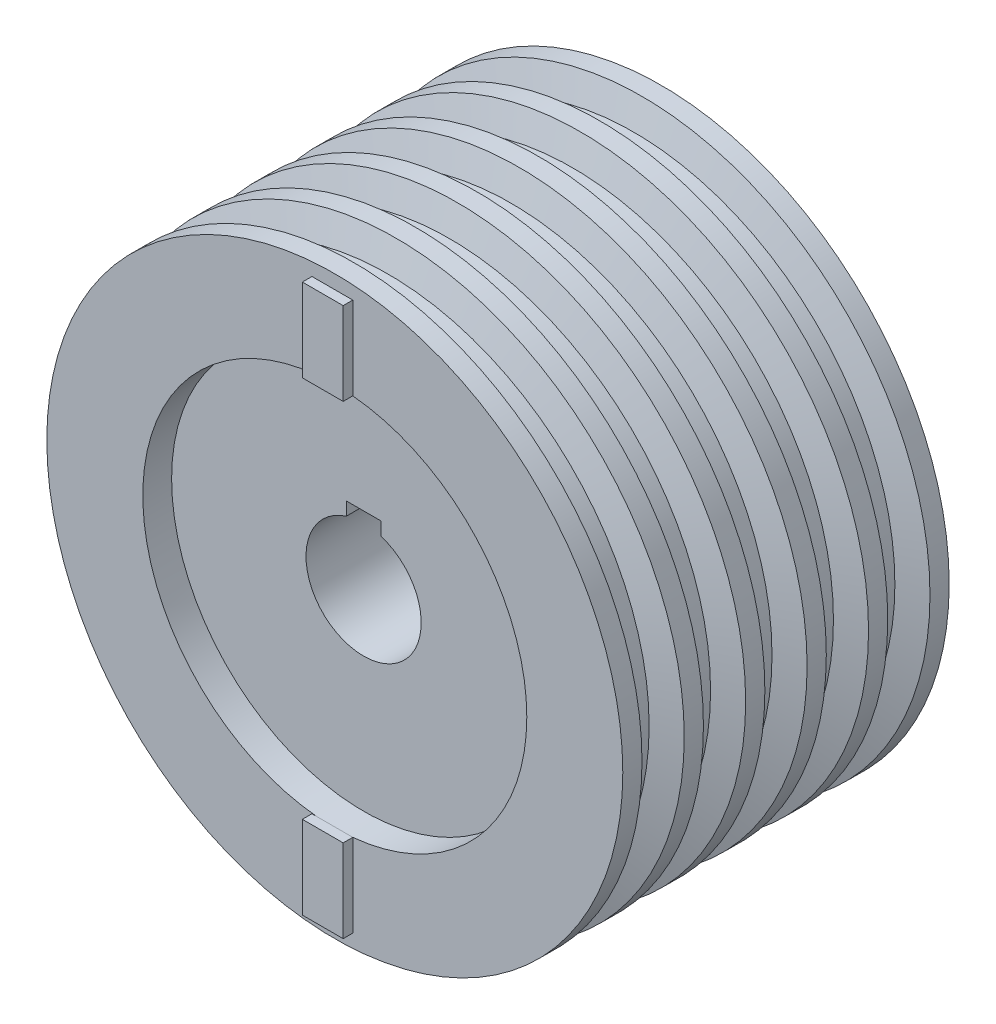
ISO-10303-21;
HEADER;
FILE_DESCRIPTION(('STEP AP214'),'2;1');
FILE_NAME('part.step','',(''),(''),'','','');
FILE_SCHEMA(('AUTOMOTIVE_DESIGN { 1 0 10303 214 1 1 1 1 }'));
ENDSEC;
DATA;
#1=APPLICATION_CONTEXT('core data for automotive mechanical design processes');
#2=APPLICATION_PROTOCOL_DEFINITION('international standard','automotive_design',2000,#1);
#3=PRODUCT_CONTEXT('',#1,'mechanical');
#4=PRODUCT('Part','Part','',(#3));
#5=PRODUCT_RELATED_PRODUCT_CATEGORY('part','',(#4));
#6=PRODUCT_DEFINITION_FORMATION('','',#4);
#7=PRODUCT_DEFINITION_CONTEXT('part definition',#1,'design');
#8=PRODUCT_DEFINITION('design','',#6,#7);
#9=PRODUCT_DEFINITION_SHAPE('','',#8);
#10=(LENGTH_UNIT() NAMED_UNIT(*) SI_UNIT(.MILLI.,.METRE.));
#11=(NAMED_UNIT(*) PLANE_ANGLE_UNIT() SI_UNIT($,.RADIAN.));
#12=(NAMED_UNIT(*) SI_UNIT($,.STERADIAN.) SOLID_ANGLE_UNIT());
#13=UNCERTAINTY_MEASURE_WITH_UNIT(LENGTH_MEASURE(1.E-05),#10,'distance_accuracy_value','');
#14=(GEOMETRIC_REPRESENTATION_CONTEXT(3) GLOBAL_UNCERTAINTY_ASSIGNED_CONTEXT((#13)) GLOBAL_UNIT_ASSIGNED_CONTEXT((#10,
#11,#12)) REPRESENTATION_CONTEXT('',''));
#15=CARTESIAN_POINT('',(0.,0.,0.));
#16=DIRECTION('',(0.,0.,1.));
#17=DIRECTION('',(1.,0.,0.));
#18=AXIS2_PLACEMENT_3D('',#15,#16,#17);
#19=CARTESIAN_POINT('',(0.,0.,85.));
#20=DIRECTION('',(0.,0.,-1.));
#21=DIRECTION('',(-1.,0.,0.));
#22=AXIS2_PLACEMENT_3D('',#19,#20,#21);
#23=CYLINDRICAL_SURFACE('',#22,150.);
#24=CARTESIAN_POINT('',(0.,0.,-75.));
#25=DIRECTION('',(0.,0.,1.));
#26=DIRECTION('',(1.,0.,0.));
#27=AXIS2_PLACEMENT_3D('',#24,#25,#26);
#28=CIRCLE('',#27,150.);
#29=CARTESIAN_POINT('',(150.,0.,-75.));
#30=VERTEX_POINT('',#29);
#31=EDGE_CURVE('E238',#30,#30,#28,.T.);
#32=ORIENTED_EDGE('',*,*,#31,.F.);
#33=EDGE_LOOP('',(#32));
#34=FACE_BOUND('',#33,.T.);
#35=CARTESIAN_POINT('',(0.,0.,-85.));
#36=DIRECTION('',(0.,0.,1.));
#37=DIRECTION('',(1.,0.,0.));
#38=AXIS2_PLACEMENT_3D('',#35,#36,#37);
#39=CIRCLE('',#38,150.);
#40=CARTESIAN_POINT('',(150.,0.,-85.));
#41=VERTEX_POINT('',#40);
#42=EDGE_CURVE('E346',#41,#41,#39,.T.);
#43=ORIENTED_EDGE('',*,*,#42,.T.);
#44=EDGE_LOOP('',(#43));
#45=FACE_BOUND('',#44,.T.);
#46=ADVANCED_FACE('F49',(#34,#45),#23,.T.);
#47=CARTESIAN_POINT('',(0.,0.,-85.));
#48=DIRECTION('',(0.,0.,1.));
#49=DIRECTION('',(1.,0.,0.));
#50=AXIS2_PLACEMENT_3D('',#47,#48,#49);
#51=CYLINDRICAL_SURFACE('',#50,30.);
#52=CARTESIAN_POINT('',(0.,0.,70.));
#53=DIRECTION('',(0.,0.,1.));
#54=DIRECTION('',(1.,0.,0.));
#55=AXIS2_PLACEMENT_3D('',#52,#53,#54);
#56=CIRCLE('',#55,30.);
#57=CARTESIAN_POINT('',(-8.99999999999999,28.6181760425084,70.));
#58=VERTEX_POINT('',#57);
#59=CARTESIAN_POINT('',(9.00000000000001,28.6181760425084,70.));
#60=VERTEX_POINT('',#59);
#61=EDGE_CURVE('E334',#58,#60,#56,.T.);
#62=ORIENTED_EDGE('',*,*,#61,.T.);
#63=DIRECTION('',(0.,0.,1.));
#64=VECTOR('',#63,1.);
#65=CARTESIAN_POINT('',(9.00000000000001,28.6181760425084,-85.));
#66=LINE('',#65,#64);
#67=CARTESIAN_POINT('',(9.00000000000001,28.6181760425084,-70.));
#68=VERTEX_POINT('',#67);
#69=EDGE_CURVE('E321',#60,#68,#66,.F.);
#70=ORIENTED_EDGE('',*,*,#69,.T.);
#71=CARTESIAN_POINT('',(0.,0.,-70.));
#72=DIRECTION('',(0.,0.,1.));
#73=DIRECTION('',(1.,0.,0.));
#74=AXIS2_PLACEMENT_3D('',#71,#72,#73);
#75=CIRCLE('',#74,30.);
#76=CARTESIAN_POINT('',(-8.99999999999999,28.6181760425084,-70.));
#77=VERTEX_POINT('',#76);
#78=EDGE_CURVE('E325',#77,#68,#75,.T.);
#79=ORIENTED_EDGE('',*,*,#78,.F.);
#80=DIRECTION('',(0.,0.,1.));
#81=VECTOR('',#80,1.);
#82=CARTESIAN_POINT('',(-8.99999999999999,28.6181760425084,-85.));
#83=LINE('',#82,#81);
#84=EDGE_CURVE('E314',#77,#58,#83,.T.);
#85=ORIENTED_EDGE('',*,*,#84,.T.);
#86=EDGE_LOOP('',(#62,#70,#79,#85));
#87=FACE_BOUND('',#86,.T.);
#88=ADVANCED_FACE('F375',(#87),#51,.F.);
#89=CARTESIAN_POINT('',(0.,0.,-85.));
#90=DIRECTION('',(0.,0.,1.));
#91=DIRECTION('',(1.,0.,0.));
#92=AXIS2_PLACEMENT_3D('',#89,#90,#91);
#93=PLANE('',#92);
#94=ORIENTED_EDGE('',*,*,#42,.F.);
#95=EDGE_LOOP('',(#94));
#96=FACE_BOUND('',#95,.T.);
#97=CARTESIAN_POINT('',(0.,0.,-85.));
#98=DIRECTION('',(0.,0.,1.));
#99=DIRECTION('',(1.,0.,0.));
#100=AXIS2_PLACEMENT_3D('',#97,#98,#99);
#101=CIRCLE('',#100,100.);
#102=CARTESIAN_POINT('',(100.,0.,-85.));
#103=VERTEX_POINT('',#102);
#104=EDGE_CURVE('E329',#103,#103,#101,.T.);
#105=ORIENTED_EDGE('',*,*,#104,.T.);
#106=EDGE_LOOP('',(#105));
#107=FACE_BOUND('',#106,.T.);
#108=ADVANCED_FACE('F463',(#96,#107),#93,.F.);
#109=CARTESIAN_POINT('',(0.,0.,75.));
#110=DIRECTION('',(0.,0.,1.));
#111=DIRECTION('',(1.,0.,0.));
#112=AXIS2_PLACEMENT_3D('',#109,#110,#111);
#113=CIRCLE('',#112,150.);
#114=CARTESIAN_POINT('',(150.,0.,75.));
#115=VERTEX_POINT('',#114);
#116=EDGE_CURVE('E171',#115,#115,#113,.T.);
#117=ORIENTED_EDGE('',*,*,#116,.T.);
#118=EDGE_LOOP('',(#117));
#119=FACE_BOUND('',#118,.T.);
#120=CARTESIAN_POINT('',(0.,0.,85.));
#121=DIRECTION('',(0.,0.,1.));
#122=DIRECTION('',(1.,0.,0.));
#123=AXIS2_PLACEMENT_3D('',#120,#121,#122);
#124=CIRCLE('',#123,150.);
#125=CARTESIAN_POINT('',(150.,0.,85.));
#126=VERTEX_POINT('',#125);
#127=EDGE_CURVE('E351',#126,#126,#124,.T.);
#128=ORIENTED_EDGE('',*,*,#127,.F.);
#129=EDGE_LOOP('',(#128));
#130=FACE_BOUND('',#129,.T.);
#131=ADVANCED_FACE('F51',(#119,#130),#23,.T.);
#132=CARTESIAN_POINT('',(0.,0.,85.));
#133=DIRECTION('',(0.,0.,1.));
#134=DIRECTION('',(1.,0.,0.));
#135=AXIS2_PLACEMENT_3D('',#132,#133,#134);
#136=PLANE('',#135);
#137=DIRECTION('',(0.,1.,0.));
#138=VECTOR('',#137,1.);
#139=CARTESIAN_POINT('',(9.35394208110603,142.779652881161,85.));
#140=LINE('',#139,#138);
#141=CARTESIAN_POINT('',(9.35394208110616,99.561557679374,85.));
#142=VERTEX_POINT('',#141);
#143=CARTESIAN_POINT('',(9.35394208110603,142.779652881161,85.));
#144=VERTEX_POINT('',#143);
#145=EDGE_CURVE('E413',#142,#144,#140,.T.);
#146=ORIENTED_EDGE('',*,*,#145,.F.);
#147=CARTESIAN_POINT('',(0.,0.,85.));
#148=DIRECTION('',(0.,0.,1.));
#149=DIRECTION('',(1.,0.,0.));
#150=AXIS2_PLACEMENT_3D('',#147,#148,#149);
#151=CIRCLE('',#150,100.);
#152=CARTESIAN_POINT('',(9.35394208110603,-99.561557679374,85.));
#153=VERTEX_POINT('',#152);
#154=EDGE_CURVE('E341',#153,#142,#151,.T.);
#155=ORIENTED_EDGE('',*,*,#154,.F.);
#156=DIRECTION('',(0.,1.,0.));
#157=VECTOR('',#156,1.);
#158=CARTESIAN_POINT('',(9.35394208110603,-142.779652881161,85.));
#159=LINE('',#158,#157);
#160=CARTESIAN_POINT('',(9.35394208110603,-142.779652881161,85.));
#161=VERTEX_POINT('',#160);
#162=EDGE_CURVE('E206',#161,#153,#159,.T.);
#163=ORIENTED_EDGE('',*,*,#162,.F.);
#164=DIRECTION('',(1.,0.,0.));
#165=VECTOR('',#164,1.);
#166=CARTESIAN_POINT('',(-11.9030294730821,-142.779652881161,85.));
#167=LINE('',#166,#165);
#168=CARTESIAN_POINT('',(-11.9030294730821,-142.779652881161,85.));
#169=VERTEX_POINT('',#168);
#170=EDGE_CURVE('E210',#169,#161,#167,.T.);
#171=ORIENTED_EDGE('',*,*,#170,.F.);
#172=DIRECTION('',(0.,-1.,0.));
#173=VECTOR('',#172,1.);
#174=CARTESIAN_POINT('',(-11.9030294730821,-142.779652881161,85.));
#175=LINE('',#174,#173);
#176=CARTESIAN_POINT('',(-11.9030294730821,-99.561557679374,85.));
#177=VERTEX_POINT('',#176);
#178=EDGE_CURVE('E199',#177,#169,#175,.T.);
#179=ORIENTED_EDGE('',*,*,#178,.F.);
#180=DIRECTION('',(-1.,0.,0.));
#181=VECTOR('',#180,1.);
#182=CARTESIAN_POINT('',(-11.9030294730821,-99.561557679374,85.));
#183=LINE('',#182,#181);
#184=CARTESIAN_POINT('',(-9.35394208110616,-99.561557679374,85.));
#185=VERTEX_POINT('',#184);
#186=EDGE_CURVE('E11',#185,#177,#183,.T.);
#187=ORIENTED_EDGE('',*,*,#186,.F.);
#188=CARTESIAN_POINT('',(-9.35394208110616,99.561557679374,85.));
#189=VERTEX_POINT('',#188);
#190=EDGE_CURVE('E350',#189,#185,#151,.T.);
#191=ORIENTED_EDGE('',*,*,#190,.F.);
#192=DIRECTION('',(1.,0.,0.));
#193=VECTOR('',#192,1.);
#194=CARTESIAN_POINT('',(-11.9030294730821,99.561557679374,85.));
#195=LINE('',#194,#193);
#196=CARTESIAN_POINT('',(-11.9030294730821,99.561557679374,85.));
#197=VERTEX_POINT('',#196);
#198=EDGE_CURVE('E405',#197,#189,#195,.T.);
#199=ORIENTED_EDGE('',*,*,#198,.F.);
#200=DIRECTION('',(0.,-1.,0.));
#201=VECTOR('',#200,1.);
#202=CARTESIAN_POINT('',(-11.9030294730821,142.779652881161,85.));
#203=LINE('',#202,#201);
#204=CARTESIAN_POINT('',(-11.9030294730821,142.779652881161,85.));
#205=VERTEX_POINT('',#204);
#206=EDGE_CURVE('E72',#205,#197,#203,.T.);
#207=ORIENTED_EDGE('',*,*,#206,.F.);
#208=DIRECTION('',(-1.,0.,0.));
#209=VECTOR('',#208,1.);
#210=CARTESIAN_POINT('',(-11.9030294730821,142.779652881161,85.));
#211=LINE('',#210,#209);
#212=EDGE_CURVE('E67',#144,#205,#211,.T.);
#213=ORIENTED_EDGE('',*,*,#212,.F.);
#214=EDGE_LOOP('',(#146,#155,#163,#171,#179,#187,#191,#199,#207,#213));
#215=FACE_BOUND('',#214,.T.);
#216=ORIENTED_EDGE('',*,*,#127,.T.);
#217=EDGE_LOOP('',(#216));
#218=FACE_BOUND('',#217,.T.);
#219=ADVANCED_FACE('F394',(#215,#218),#136,.T.);
#220=CARTESIAN_POINT('',(0.,0.,70.));
#221=DIRECTION('',(0.,0.,1.));
#222=DIRECTION('',(1.,0.,0.));
#223=AXIS2_PLACEMENT_3D('',#220,#221,#222);
#224=CYLINDRICAL_SURFACE('',#223,100.);
#225=CARTESIAN_POINT('',(0.,0.,70.));
#226=DIRECTION('',(0.,0.,1.));
#227=DIRECTION('',(1.,0.,0.));
#228=AXIS2_PLACEMENT_3D('',#225,#226,#227);
#229=CIRCLE('',#228,100.);
#230=CARTESIAN_POINT('',(100.,0.,70.));
#231=VERTEX_POINT('',#230);
#232=EDGE_CURVE('E342',#231,#231,#229,.T.);
#233=ORIENTED_EDGE('',*,*,#232,.F.);
#234=EDGE_LOOP('',(#233));
#235=FACE_BOUND('',#234,.T.);
#236=EDGE_CURVE('E347',#142,#189,#151,.T.);
#237=ORIENTED_EDGE('',*,*,#236,.T.);
#238=ORIENTED_EDGE('',*,*,#190,.T.);
#239=EDGE_CURVE('E407',#185,#153,#151,.T.);
#240=ORIENTED_EDGE('',*,*,#239,.T.);
#241=ORIENTED_EDGE('',*,*,#154,.T.);
#242=EDGE_LOOP('',(#237,#238,#240,#241));
#243=FACE_BOUND('',#242,.T.);
#244=ADVANCED_FACE('F388',(#235,#243),#224,.F.);
#245=CARTESIAN_POINT('',(0.,0.,70.));
#246=DIRECTION('',(0.,0.,1.));
#247=DIRECTION('',(1.,0.,0.));
#248=AXIS2_PLACEMENT_3D('',#245,#246,#247);
#249=PLANE('',#248);
#250=DIRECTION('',(0.,1.,0.));
#251=VECTOR('',#250,1.);
#252=CARTESIAN_POINT('',(9.00000000000001,24.5,70.));
#253=LINE('',#252,#251);
#254=CARTESIAN_POINT('',(9.00000000000001,35.5,70.));
#255=VERTEX_POINT('',#254);
#256=EDGE_CURVE('E242',#60,#255,#253,.T.);
#257=ORIENTED_EDGE('',*,*,#256,.F.);
#258=ORIENTED_EDGE('',*,*,#61,.F.);
#259=DIRECTION('',(0.,-1.,0.));
#260=VECTOR('',#259,1.);
#261=CARTESIAN_POINT('',(-8.99999999999999,24.5,70.));
#262=LINE('',#261,#260);
#263=CARTESIAN_POINT('',(-8.99999999999999,35.5,70.));
#264=VERTEX_POINT('',#263);
#265=EDGE_CURVE('E307',#264,#58,#262,.T.);
#266=ORIENTED_EDGE('',*,*,#265,.F.);
#267=DIRECTION('',(-1.,0.,0.));
#268=VECTOR('',#267,1.);
#269=CARTESIAN_POINT('',(-8.99999999999999,35.5,70.));
#270=LINE('',#269,#268);
#271=EDGE_CURVE('E303',#255,#264,#270,.T.);
#272=ORIENTED_EDGE('',*,*,#271,.F.);
#273=EDGE_LOOP('',(#257,#258,#266,#272));
#274=FACE_BOUND('',#273,.T.);
#275=ORIENTED_EDGE('',*,*,#232,.T.);
#276=EDGE_LOOP('',(#275));
#277=FACE_BOUND('',#276,.T.);
#278=ADVANCED_FACE('F385',(#274,#277),#249,.T.);
#279=CARTESIAN_POINT('',(0.,0.,-70.));
#280=DIRECTION('',(0.,0.,-1.));
#281=DIRECTION('',(1.,0.,0.));
#282=AXIS2_PLACEMENT_3D('',#279,#280,#281);
#283=PLANE('',#282);
#284=DIRECTION('',(0.,-1.,0.));
#285=VECTOR('',#284,1.);
#286=CARTESIAN_POINT('',(9.00000000000001,0.,-70.));
#287=LINE('',#286,#285);
#288=CARTESIAN_POINT('',(9.00000000000001,35.5,-70.));
#289=VERTEX_POINT('',#288);
#290=EDGE_CURVE('E53',#289,#68,#287,.T.);
#291=ORIENTED_EDGE('',*,*,#290,.F.);
#292=DIRECTION('',(1.,0.,0.));
#293=VECTOR('',#292,1.);
#294=CARTESIAN_POINT('',(0.,35.5,-70.));
#295=LINE('',#294,#293);
#296=CARTESIAN_POINT('',(-8.99999999999999,35.5,-70.));
#297=VERTEX_POINT('',#296);
#298=EDGE_CURVE('E355',#297,#289,#295,.T.);
#299=ORIENTED_EDGE('',*,*,#298,.F.);
#300=DIRECTION('',(0.,1.,0.));
#301=VECTOR('',#300,1.);
#302=CARTESIAN_POINT('',(-8.99999999999999,0.,-70.));
#303=LINE('',#302,#301);
#304=EDGE_CURVE('E360',#77,#297,#303,.T.);
#305=ORIENTED_EDGE('',*,*,#304,.F.);
#306=ORIENTED_EDGE('',*,*,#78,.T.);
#307=EDGE_LOOP('',(#291,#299,#305,#306));
#308=FACE_BOUND('',#307,.T.);
#309=CARTESIAN_POINT('',(0.,0.,-70.));
#310=DIRECTION('',(0.,0.,1.));
#311=DIRECTION('',(1.,0.,0.));
#312=AXIS2_PLACEMENT_3D('',#309,#310,#311);
#313=CIRCLE('',#312,100.);
#314=CARTESIAN_POINT('',(100.,0.,-70.));
#315=VERTEX_POINT('',#314);
#316=EDGE_CURVE('E330',#315,#315,#313,.T.);
#317=ORIENTED_EDGE('',*,*,#316,.F.);
#318=EDGE_LOOP('',(#317));
#319=FACE_BOUND('',#318,.T.);
#320=ADVANCED_FACE('F377',(#308,#319),#283,.T.);
#321=CARTESIAN_POINT('',(0.,0.,-70.));
#322=DIRECTION('',(0.,0.,-1.));
#323=DIRECTION('',(-1.,0.,0.));
#324=AXIS2_PLACEMENT_3D('',#321,#322,#323);
#325=CYLINDRICAL_SURFACE('',#324,100.);
#326=ORIENTED_EDGE('',*,*,#316,.T.);
#327=EDGE_LOOP('',(#326));
#328=FACE_BOUND('',#327,.T.);
#329=ORIENTED_EDGE('',*,*,#104,.F.);
#330=EDGE_LOOP('',(#329));
#331=FACE_BOUND('',#330,.T.);
#332=ADVANCED_FACE('F564',(#328,#331),#325,.F.);
#333=CARTESIAN_POINT('',(9.00000000000001,24.5,-85.));
#334=DIRECTION('',(1.,0.,0.));
#335=DIRECTION('',(0.,0.,-1.));
#336=AXIS2_PLACEMENT_3D('',#333,#334,#335);
#337=PLANE('',#336);
#338=ORIENTED_EDGE('',*,*,#256,.T.);
#339=DIRECTION('',(0.,0.,1.));
#340=VECTOR('',#339,1.);
#341=CARTESIAN_POINT('',(9.00000000000001,35.5,-85.));
#342=LINE('',#341,#340);
#343=EDGE_CURVE('E310',#289,#255,#342,.T.);
#344=ORIENTED_EDGE('',*,*,#343,.F.);
#345=ORIENTED_EDGE('',*,*,#290,.T.);
#346=ORIENTED_EDGE('',*,*,#69,.F.);
#347=EDGE_LOOP('',(#338,#344,#345,#346));
#348=FACE_BOUND('',#347,.T.);
#349=ADVANCED_FACE('F370',(#348),#337,.F.);
#350=CARTESIAN_POINT('',(-8.99999999999999,24.5,-85.));
#351=DIRECTION('',(-1.,0.,0.));
#352=DIRECTION('',(0.,0.,1.));
#353=AXIS2_PLACEMENT_3D('',#350,#351,#352);
#354=PLANE('',#353);
#355=ORIENTED_EDGE('',*,*,#304,.T.);
#356=DIRECTION('',(0.,0.,1.));
#357=VECTOR('',#356,1.);
#358=CARTESIAN_POINT('',(-8.99999999999999,35.5,-85.));
#359=LINE('',#358,#357);
#360=EDGE_CURVE('E311',#297,#264,#359,.T.);
#361=ORIENTED_EDGE('',*,*,#360,.T.);
#362=ORIENTED_EDGE('',*,*,#265,.T.);
#363=ORIENTED_EDGE('',*,*,#84,.F.);
#364=EDGE_LOOP('',(#355,#361,#362,#363));
#365=FACE_BOUND('',#364,.T.);
#366=ADVANCED_FACE('F383',(#365),#354,.F.);
#367=CARTESIAN_POINT('',(-8.99999999999999,35.5,-85.));
#368=DIRECTION('',(0.,1.,0.));
#369=DIRECTION('',(0.,0.,1.));
#370=AXIS2_PLACEMENT_3D('',#367,#368,#369);
#371=PLANE('',#370);
#372=ORIENTED_EDGE('',*,*,#298,.T.);
#373=ORIENTED_EDGE('',*,*,#343,.T.);
#374=ORIENTED_EDGE('',*,*,#271,.T.);
#375=ORIENTED_EDGE('',*,*,#360,.F.);
#376=EDGE_LOOP('',(#372,#373,#374,#375));
#377=FACE_BOUND('',#376,.T.);
#378=ADVANCED_FACE('F380',(#377),#371,.F.);
#379=CARTESIAN_POINT('',(0.,0.,53.));
#380=DIRECTION('',(0.,0.,-1.));
#381=DIRECTION('',(-1.,0.,0.));
#382=AXIS2_PLACEMENT_3D('',#379,#380,#381);
#383=CONICAL_SURFACE('',#382,150.,1.27409035395586);
#384=CARTESIAN_POINT('',(0.,0.,57.2802295404213));
#385=DIRECTION('',(0.,0.,1.));
#386=DIRECTION('',(1.,0.,0.));
#387=AXIS2_PLACEMENT_3D('',#384,#385,#386);
#388=CIRCLE('',#387,136.);
#389=CARTESIAN_POINT('',(136.,0.,57.2802295404213));
#390=VERTEX_POINT('',#389);
#391=EDGE_CURVE('E294',#390,#390,#388,.T.);
#392=ORIENTED_EDGE('',*,*,#391,.F.);
#393=EDGE_LOOP('',(#392));
#394=FACE_BOUND('',#393,.T.);
#395=CARTESIAN_POINT('',(0.,0.,53.));
#396=DIRECTION('',(0.,0.,1.));
#397=DIRECTION('',(1.,0.,0.));
#398=AXIS2_PLACEMENT_3D('',#395,#396,#397);
#399=CIRCLE('',#398,150.);
#400=CARTESIAN_POINT('',(150.,0.,53.));
#401=VERTEX_POINT('',#400);
#402=EDGE_CURVE('E280',#401,#401,#399,.T.);
#403=ORIENTED_EDGE('',*,*,#402,.T.);
#404=EDGE_LOOP('',(#403));
#405=FACE_BOUND('',#404,.T.);
#406=ADVANCED_FACE('F555',(#394,#405),#383,.T.);
#407=CARTESIAN_POINT('',(0.,0.,0.));
#408=DIRECTION('',(0.,0.,1.));
#409=DIRECTION('',(1.,0.,0.));
#410=AXIS2_PLACEMENT_3D('',#407,#408,#409);
#411=CYLINDRICAL_SURFACE('',#410,136.);
#412=CARTESIAN_POINT('',(0.,0.,70.7197704595789));
#413=DIRECTION('',(0.,0.,1.));
#414=DIRECTION('',(1.,0.,0.));
#415=AXIS2_PLACEMENT_3D('',#412,#413,#414);
#416=CIRCLE('',#415,136.);
#417=CARTESIAN_POINT('',(136.,0.,70.7197704595789));
#418=VERTEX_POINT('',#417);
#419=EDGE_CURVE('E176',#418,#418,#416,.T.);
#420=ORIENTED_EDGE('',*,*,#419,.F.);
#421=EDGE_LOOP('',(#420));
#422=FACE_BOUND('',#421,.T.);
#423=ORIENTED_EDGE('',*,*,#391,.T.);
#424=EDGE_LOOP('',(#423));
#425=FACE_BOUND('',#424,.T.);
#426=ADVANCED_FACE('F494',(#422,#425),#411,.T.);
#427=CARTESIAN_POINT('',(0.,0.,70.7197704595789));
#428=DIRECTION('',(0.,0.,1.));
#429=DIRECTION('',(1.,0.,0.));
#430=AXIS2_PLACEMENT_3D('',#427,#428,#429);
#431=CONICAL_SURFACE('',#430,136.,1.27409035395587);
#432=ORIENTED_EDGE('',*,*,#116,.F.);
#433=EDGE_LOOP('',(#432));
#434=FACE_BOUND('',#433,.T.);
#435=ORIENTED_EDGE('',*,*,#419,.T.);
#436=EDGE_LOOP('',(#435));
#437=FACE_BOUND('',#436,.T.);
#438=ADVANCED_FACE('F484',(#434,#437),#431,.T.);
#439=CARTESIAN_POINT('',(0.,0.,43.));
#440=DIRECTION('',(0.,0.,1.));
#441=DIRECTION('',(1.,0.,0.));
#442=AXIS2_PLACEMENT_3D('',#439,#440,#441);
#443=CIRCLE('',#442,150.);
#444=CARTESIAN_POINT('',(150.,0.,43.));
#445=VERTEX_POINT('',#444);
#446=EDGE_CURVE('E284',#445,#445,#443,.T.);
#447=ORIENTED_EDGE('',*,*,#446,.T.);
#448=EDGE_LOOP('',(#447));
#449=FACE_BOUND('',#448,.T.);
#450=ORIENTED_EDGE('',*,*,#402,.F.);
#451=EDGE_LOOP('',(#450));
#452=FACE_BOUND('',#451,.T.);
#453=ADVANCED_FACE('F473',(#449,#452),#23,.T.);
#454=CARTESIAN_POINT('',(0.,0.,21.));
#455=DIRECTION('',(0.,0.,-1.));
#456=DIRECTION('',(-1.,0.,0.));
#457=AXIS2_PLACEMENT_3D('',#454,#455,#456);
#458=CONICAL_SURFACE('',#457,150.,1.27409035395587);
#459=CARTESIAN_POINT('',(0.,0.,25.280229540421));
#460=DIRECTION('',(0.,0.,1.));
#461=DIRECTION('',(1.,0.,0.));
#462=AXIS2_PLACEMENT_3D('',#459,#460,#461);
#463=CIRCLE('',#462,136.);
#464=CARTESIAN_POINT('',(136.,0.,25.280229540421));
#465=VERTEX_POINT('',#464);
#466=EDGE_CURVE('E275',#465,#465,#463,.T.);
#467=ORIENTED_EDGE('',*,*,#466,.F.);
#468=EDGE_LOOP('',(#467));
#469=FACE_BOUND('',#468,.T.);
#470=CARTESIAN_POINT('',(0.,0.,21.));
#471=DIRECTION('',(0.,0.,1.));
#472=DIRECTION('',(1.,0.,0.));
#473=AXIS2_PLACEMENT_3D('',#470,#471,#472);
#474=CIRCLE('',#473,150.);
#475=CARTESIAN_POINT('',(150.,0.,21.));
#476=VERTEX_POINT('',#475);
#477=EDGE_CURVE('E264',#476,#476,#474,.T.);
#478=ORIENTED_EDGE('',*,*,#477,.T.);
#479=EDGE_LOOP('',(#478));
#480=FACE_BOUND('',#479,.T.);
#481=ADVANCED_FACE('F483',(#469,#480),#458,.T.);
#482=CARTESIAN_POINT('',(0.,0.,38.7197704595787));
#483=DIRECTION('',(0.,0.,1.));
#484=DIRECTION('',(1.,0.,0.));
#485=AXIS2_PLACEMENT_3D('',#482,#483,#484);
#486=CONICAL_SURFACE('',#485,136.,1.27409035395586);
#487=ORIENTED_EDGE('',*,*,#446,.F.);
#488=EDGE_LOOP('',(#487));
#489=FACE_BOUND('',#488,.T.);
#490=CARTESIAN_POINT('',(0.,0.,38.7197704595787));
#491=DIRECTION('',(0.,0.,1.));
#492=DIRECTION('',(1.,0.,0.));
#493=AXIS2_PLACEMENT_3D('',#490,#491,#492);
#494=CIRCLE('',#493,136.);
#495=CARTESIAN_POINT('',(136.,0.,38.7197704595787));
#496=VERTEX_POINT('',#495);
#497=EDGE_CURVE('E279',#496,#496,#494,.T.);
#498=ORIENTED_EDGE('',*,*,#497,.T.);
#499=EDGE_LOOP('',(#498));
#500=FACE_BOUND('',#499,.T.);
#501=ADVANCED_FACE('F491',(#489,#500),#486,.T.);
#502=CARTESIAN_POINT('',(0.,0.,0.));
#503=DIRECTION('',(0.,0.,1.));
#504=DIRECTION('',(1.,0.,0.));
#505=AXIS2_PLACEMENT_3D('',#502,#503,#504);
#506=CYLINDRICAL_SURFACE('',#505,136.);
#507=ORIENTED_EDGE('',*,*,#497,.F.);
#508=EDGE_LOOP('',(#507));
#509=FACE_BOUND('',#508,.T.);
#510=ORIENTED_EDGE('',*,*,#466,.T.);
#511=EDGE_LOOP('',(#510));
#512=FACE_BOUND('',#511,.T.);
#513=ADVANCED_FACE('F500',(#509,#512),#506,.T.);
#514=CARTESIAN_POINT('',(0.,0.,11.));
#515=DIRECTION('',(0.,0.,1.));
#516=DIRECTION('',(1.,0.,0.));
#517=AXIS2_PLACEMENT_3D('',#514,#515,#516);
#518=CIRCLE('',#517,150.);
#519=CARTESIAN_POINT('',(150.,0.,11.));
#520=VERTEX_POINT('',#519);
#521=EDGE_CURVE('E259',#520,#520,#518,.T.);
#522=ORIENTED_EDGE('',*,*,#521,.T.);
#523=EDGE_LOOP('',(#522));
#524=FACE_BOUND('',#523,.T.);
#525=ORIENTED_EDGE('',*,*,#477,.F.);
#526=EDGE_LOOP('',(#525));
#527=FACE_BOUND('',#526,.T.);
#528=ADVANCED_FACE('F486',(#524,#527),#23,.T.);
#529=CARTESIAN_POINT('',(0.,0.,-11.));
#530=DIRECTION('',(0.,0.,-1.));
#531=DIRECTION('',(-1.,0.,0.));
#532=AXIS2_PLACEMENT_3D('',#529,#530,#531);
#533=CONICAL_SURFACE('',#532,150.,1.27409035395586);
#534=CARTESIAN_POINT('',(0.,0.,-6.7197704595787));
#535=DIRECTION('',(0.,0.,1.));
#536=DIRECTION('',(1.,0.,0.));
#537=AXIS2_PLACEMENT_3D('',#534,#535,#536);
#538=CIRCLE('',#537,136.);
#539=CARTESIAN_POINT('',(136.,0.,-6.7197704595787));
#540=VERTEX_POINT('',#539);
#541=EDGE_CURVE('E268',#540,#540,#538,.T.);
#542=ORIENTED_EDGE('',*,*,#541,.F.);
#543=EDGE_LOOP('',(#542));
#544=FACE_BOUND('',#543,.T.);
#545=CARTESIAN_POINT('',(0.,0.,-11.));
#546=DIRECTION('',(0.,0.,1.));
#547=DIRECTION('',(1.,0.,0.));
#548=AXIS2_PLACEMENT_3D('',#545,#546,#547);
#549=CIRCLE('',#548,150.);
#550=CARTESIAN_POINT('',(150.,0.,-11.));
#551=VERTEX_POINT('',#550);
#552=EDGE_CURVE('E248',#551,#551,#549,.T.);
#553=ORIENTED_EDGE('',*,*,#552,.T.);
#554=EDGE_LOOP('',(#553));
#555=FACE_BOUND('',#554,.T.);
#556=ADVANCED_FACE('F499',(#544,#555),#533,.T.);
#557=CARTESIAN_POINT('',(0.,0.,0.));
#558=DIRECTION('',(0.,0.,1.));
#559=DIRECTION('',(1.,0.,0.));
#560=AXIS2_PLACEMENT_3D('',#557,#558,#559);
#561=CYLINDRICAL_SURFACE('',#560,136.);
#562=CARTESIAN_POINT('',(0.,0.,6.71977045957891));
#563=DIRECTION('',(0.,0.,1.));
#564=DIRECTION('',(1.,0.,0.));
#565=AXIS2_PLACEMENT_3D('',#562,#563,#564);
#566=CIRCLE('',#565,136.);
#567=CARTESIAN_POINT('',(136.,0.,6.71977045957891));
#568=VERTEX_POINT('',#567);
#569=EDGE_CURVE('E263',#568,#568,#566,.T.);
#570=ORIENTED_EDGE('',*,*,#569,.F.);
#571=EDGE_LOOP('',(#570));
#572=FACE_BOUND('',#571,.T.);
#573=ORIENTED_EDGE('',*,*,#541,.T.);
#574=EDGE_LOOP('',(#573));
#575=FACE_BOUND('',#574,.T.);
#576=ADVANCED_FACE('F506',(#572,#575),#561,.T.);
#577=CARTESIAN_POINT('',(0.,0.,6.71977045957891));
#578=DIRECTION('',(0.,0.,1.));
#579=DIRECTION('',(1.,0.,0.));
#580=AXIS2_PLACEMENT_3D('',#577,#578,#579);
#581=CONICAL_SURFACE('',#580,136.,1.27409035395587);
#582=ORIENTED_EDGE('',*,*,#521,.F.);
#583=EDGE_LOOP('',(#582));
#584=FACE_BOUND('',#583,.T.);
#585=ORIENTED_EDGE('',*,*,#569,.T.);
#586=EDGE_LOOP('',(#585));
#587=FACE_BOUND('',#586,.T.);
#588=ADVANCED_FACE('F514',(#584,#587),#581,.T.);
#589=CARTESIAN_POINT('',(0.,0.,-21.));
#590=DIRECTION('',(0.,0.,1.));
#591=DIRECTION('',(1.,0.,0.));
#592=AXIS2_PLACEMENT_3D('',#589,#590,#591);
#593=CIRCLE('',#592,150.);
#594=CARTESIAN_POINT('',(150.,0.,-21.));
#595=VERTEX_POINT('',#594);
#596=EDGE_CURVE('E252',#595,#595,#593,.T.);
#597=ORIENTED_EDGE('',*,*,#596,.T.);
#598=EDGE_LOOP('',(#597));
#599=FACE_BOUND('',#598,.T.);
#600=ORIENTED_EDGE('',*,*,#552,.F.);
#601=EDGE_LOOP('',(#600));
#602=FACE_BOUND('',#601,.T.);
#603=ADVANCED_FACE('F471',(#599,#602),#23,.T.);
#604=CARTESIAN_POINT('',(0.,0.,-43.));
#605=DIRECTION('',(0.,0.,-1.));
#606=DIRECTION('',(-1.,0.,0.));
#607=AXIS2_PLACEMENT_3D('',#604,#605,#606);
#608=CONICAL_SURFACE('',#607,150.,1.27409035395587);
#609=CARTESIAN_POINT('',(0.,0.,-38.7197704595789));
#610=DIRECTION('',(0.,0.,1.));
#611=DIRECTION('',(1.,0.,0.));
#612=AXIS2_PLACEMENT_3D('',#609,#610,#611);
#613=CIRCLE('',#612,136.);
#614=CARTESIAN_POINT('',(136.,0.,-38.7197704595789));
#615=VERTEX_POINT('',#614);
#616=EDGE_CURVE('E243',#615,#615,#613,.T.);
#617=ORIENTED_EDGE('',*,*,#616,.F.);
#618=EDGE_LOOP('',(#617));
#619=FACE_BOUND('',#618,.T.);
#620=CARTESIAN_POINT('',(0.,0.,-43.));
#621=DIRECTION('',(0.,0.,1.));
#622=DIRECTION('',(1.,0.,0.));
#623=AXIS2_PLACEMENT_3D('',#620,#621,#622);
#624=CIRCLE('',#623,150.);
#625=CARTESIAN_POINT('',(150.,0.,-43.));
#626=VERTEX_POINT('',#625);
#627=EDGE_CURVE('E230',#626,#626,#624,.T.);
#628=ORIENTED_EDGE('',*,*,#627,.T.);
#629=EDGE_LOOP('',(#628));
#630=FACE_BOUND('',#629,.T.);
#631=ADVANCED_FACE('F513',(#619,#630),#608,.T.);
#632=CARTESIAN_POINT('',(0.,0.,-25.2802295404213));
#633=DIRECTION('',(0.,0.,1.));
#634=DIRECTION('',(1.,0.,0.));
#635=AXIS2_PLACEMENT_3D('',#632,#633,#634);
#636=CONICAL_SURFACE('',#635,136.,1.27409035395586);
#637=ORIENTED_EDGE('',*,*,#596,.F.);
#638=EDGE_LOOP('',(#637));
#639=FACE_BOUND('',#638,.T.);
#640=CARTESIAN_POINT('',(0.,0.,-25.2802295404213));
#641=DIRECTION('',(0.,0.,1.));
#642=DIRECTION('',(1.,0.,0.));
#643=AXIS2_PLACEMENT_3D('',#640,#641,#642);
#644=CIRCLE('',#643,136.);
#645=CARTESIAN_POINT('',(136.,0.,-25.2802295404213));
#646=VERTEX_POINT('',#645);
#647=EDGE_CURVE('E247',#646,#646,#644,.T.);
#648=ORIENTED_EDGE('',*,*,#647,.T.);
#649=EDGE_LOOP('',(#648));
#650=FACE_BOUND('',#649,.T.);
#651=ADVANCED_FACE('F520',(#639,#650),#636,.T.);
#652=CARTESIAN_POINT('',(0.,0.,0.));
#653=DIRECTION('',(0.,0.,1.));
#654=DIRECTION('',(1.,0.,0.));
#655=AXIS2_PLACEMENT_3D('',#652,#653,#654);
#656=CYLINDRICAL_SURFACE('',#655,136.);
#657=ORIENTED_EDGE('',*,*,#647,.F.);
#658=EDGE_LOOP('',(#657));
#659=FACE_BOUND('',#658,.T.);
#660=ORIENTED_EDGE('',*,*,#616,.T.);
#661=EDGE_LOOP('',(#660));
#662=FACE_BOUND('',#661,.T.);
#663=ADVANCED_FACE('F469',(#659,#662),#656,.T.);
#664=CARTESIAN_POINT('',(0.,0.,-53.));
#665=DIRECTION('',(0.,0.,1.));
#666=DIRECTION('',(1.,0.,0.));
#667=AXIS2_PLACEMENT_3D('',#664,#665,#666);
#668=CIRCLE('',#667,150.);
#669=CARTESIAN_POINT('',(150.,0.,-53.));
#670=VERTEX_POINT('',#669);
#671=EDGE_CURVE('E225',#670,#670,#668,.T.);
#672=ORIENTED_EDGE('',*,*,#671,.T.);
#673=EDGE_LOOP('',(#672));
#674=FACE_BOUND('',#673,.T.);
#675=ORIENTED_EDGE('',*,*,#627,.F.);
#676=EDGE_LOOP('',(#675));
#677=FACE_BOUND('',#676,.T.);
#678=ADVANCED_FACE('F457',(#674,#677),#23,.T.);
#679=CARTESIAN_POINT('',(0.,0.,-75.));
#680=DIRECTION('',(0.,0.,-1.));
#681=DIRECTION('',(-1.,0.,0.));
#682=AXIS2_PLACEMENT_3D('',#679,#680,#681);
#683=CONICAL_SURFACE('',#682,150.,1.27409035395586);
#684=CARTESIAN_POINT('',(0.,0.,-70.7197704595787));
#685=DIRECTION('',(0.,0.,1.));
#686=DIRECTION('',(1.,0.,0.));
#687=AXIS2_PLACEMENT_3D('',#684,#685,#686);
#688=CIRCLE('',#687,136.);
#689=CARTESIAN_POINT('',(136.,0.,-70.7197704595787));
#690=VERTEX_POINT('',#689);
#691=EDGE_CURVE('E234',#690,#690,#688,.T.);
#692=ORIENTED_EDGE('',*,*,#691,.F.);
#693=EDGE_LOOP('',(#692));
#694=FACE_BOUND('',#693,.T.);
#695=ORIENTED_EDGE('',*,*,#31,.T.);
#696=EDGE_LOOP('',(#695));
#697=FACE_BOUND('',#696,.T.);
#698=ADVANCED_FACE('F468',(#694,#697),#683,.T.);
#699=CARTESIAN_POINT('',(0.,0.,0.));
#700=DIRECTION('',(0.,0.,1.));
#701=DIRECTION('',(1.,0.,0.));
#702=AXIS2_PLACEMENT_3D('',#699,#700,#701);
#703=CYLINDRICAL_SURFACE('',#702,136.);
#704=CARTESIAN_POINT('',(0.,0.,-57.2802295404211));
#705=DIRECTION('',(0.,0.,1.));
#706=DIRECTION('',(1.,0.,0.));
#707=AXIS2_PLACEMENT_3D('',#704,#705,#706);
#708=CIRCLE('',#707,136.);
#709=CARTESIAN_POINT('',(136.,0.,-57.2802295404211));
#710=VERTEX_POINT('',#709);
#711=EDGE_CURVE('E229',#710,#710,#708,.T.);
#712=ORIENTED_EDGE('',*,*,#711,.F.);
#713=EDGE_LOOP('',(#712));
#714=FACE_BOUND('',#713,.T.);
#715=ORIENTED_EDGE('',*,*,#691,.T.);
#716=EDGE_LOOP('',(#715));
#717=FACE_BOUND('',#716,.T.);
#718=ADVANCED_FACE('F711',(#714,#717),#703,.T.);
#719=CARTESIAN_POINT('',(0.,0.,-57.2802295404211));
#720=DIRECTION('',(0.,0.,1.));
#721=DIRECTION('',(1.,0.,0.));
#722=AXIS2_PLACEMENT_3D('',#719,#720,#721);
#723=CONICAL_SURFACE('',#722,136.,1.27409035395587);
#724=ORIENTED_EDGE('',*,*,#671,.F.);
#725=EDGE_LOOP('',(#724));
#726=FACE_BOUND('',#725,.T.);
#727=ORIENTED_EDGE('',*,*,#711,.T.);
#728=EDGE_LOOP('',(#727));
#729=FACE_BOUND('',#728,.T.);
#730=ADVANCED_FACE('F720',(#726,#729),#723,.T.);
#731=CARTESIAN_POINT('',(-11.9030294730821,-142.779652881161,90.));
#732=DIRECTION('',(0.,1.,0.));
#733=DIRECTION('',(0.,0.,1.));
#734=AXIS2_PLACEMENT_3D('',#731,#732,#733);
#735=PLANE('',#734);
#736=ORIENTED_EDGE('',*,*,#170,.T.);
#737=DIRECTION('',(0.,0.,-1.));
#738=VECTOR('',#737,1.);
#739=CARTESIAN_POINT('',(9.35394208110603,-142.779652881161,90.));
#740=LINE('',#739,#738);
#741=CARTESIAN_POINT('',(9.35394208110603,-142.779652881161,90.));
#742=VERTEX_POINT('',#741);
#743=EDGE_CURVE('E182',#742,#161,#740,.T.);
#744=ORIENTED_EDGE('',*,*,#743,.F.);
#745=DIRECTION('',(1.,0.,0.));
#746=VECTOR('',#745,1.);
#747=CARTESIAN_POINT('',(-11.9030294730821,-142.779652881161,90.));
#748=LINE('',#747,#746);
#749=CARTESIAN_POINT('',(-11.9030294730821,-142.779652881161,90.));
#750=VERTEX_POINT('',#749);
#751=EDGE_CURVE('E202',#750,#742,#748,.T.);
#752=ORIENTED_EDGE('',*,*,#751,.F.);
#753=DIRECTION('',(0.,0.,-1.));
#754=VECTOR('',#753,1.);
#755=CARTESIAN_POINT('',(-11.9030294730821,-142.779652881161,90.));
#756=LINE('',#755,#754);
#757=EDGE_CURVE('E194',#750,#169,#756,.T.);
#758=ORIENTED_EDGE('',*,*,#757,.T.);
#759=EDGE_LOOP('',(#736,#744,#752,#758));
#760=FACE_BOUND('',#759,.T.);
#761=ADVANCED_FACE('F729',(#760),#735,.F.);
#762=CARTESIAN_POINT('',(9.35394208110603,-142.779652881161,90.));
#763=DIRECTION('',(-1.,0.,0.));
#764=DIRECTION('',(0.,0.,1.));
#765=AXIS2_PLACEMENT_3D('',#762,#763,#764);
#766=PLANE('',#765);
#767=ORIENTED_EDGE('',*,*,#162,.T.);
#768=DIRECTION('',(0.,0.,-1.));
#769=VECTOR('',#768,1.);
#770=CARTESIAN_POINT('',(9.35394208110603,-99.561557679374,90.));
#771=LINE('',#770,#769);
#772=CARTESIAN_POINT('',(9.35394208110603,-99.561557679374,90.));
#773=VERTEX_POINT('',#772);
#774=EDGE_CURVE('E186',#773,#153,#771,.T.);
#775=ORIENTED_EDGE('',*,*,#774,.F.);
#776=DIRECTION('',(0.,1.,0.));
#777=VECTOR('',#776,1.);
#778=CARTESIAN_POINT('',(9.35394208110603,-142.779652881161,90.));
#779=LINE('',#778,#777);
#780=EDGE_CURVE('E219',#742,#773,#779,.T.);
#781=ORIENTED_EDGE('',*,*,#780,.F.);
#782=ORIENTED_EDGE('',*,*,#743,.T.);
#783=EDGE_LOOP('',(#767,#775,#781,#782));
#784=FACE_BOUND('',#783,.T.);
#785=ADVANCED_FACE('F433',(#784),#766,.F.);
#786=CARTESIAN_POINT('',(-11.9030294730821,-99.561557679374,90.));
#787=DIRECTION('',(0.,-1.,0.));
#788=DIRECTION('',(0.,0.,-1.));
#789=AXIS2_PLACEMENT_3D('',#786,#787,#788);
#790=PLANE('',#789);
#791=EDGE_CURVE('E60',#153,#185,#183,.T.);
#792=ORIENTED_EDGE('',*,*,#791,.T.);
#793=ORIENTED_EDGE('',*,*,#186,.T.);
#794=DIRECTION('',(0.,0.,-1.));
#795=VECTOR('',#794,1.);
#796=CARTESIAN_POINT('',(-11.9030294730821,-99.561557679374,90.));
#797=LINE('',#796,#795);
#798=CARTESIAN_POINT('',(-11.9030294730821,-99.561557679374,90.));
#799=VERTEX_POINT('',#798);
#800=EDGE_CURVE('E190',#799,#177,#797,.T.);
#801=ORIENTED_EDGE('',*,*,#800,.F.);
#802=DIRECTION('',(-1.,0.,0.));
#803=VECTOR('',#802,1.);
#804=CARTESIAN_POINT('',(-11.9030294730821,-99.561557679374,90.));
#805=LINE('',#804,#803);
#806=EDGE_CURVE('E216',#773,#799,#805,.T.);
#807=ORIENTED_EDGE('',*,*,#806,.F.);
#808=ORIENTED_EDGE('',*,*,#774,.T.);
#809=EDGE_LOOP('',(#792,#793,#801,#807,#808));
#810=FACE_BOUND('',#809,.T.);
#811=ADVANCED_FACE('F438',(#810),#790,.F.);
#812=CARTESIAN_POINT('',(-11.9030294730821,-142.779652881161,90.));
#813=DIRECTION('',(1.,0.,0.));
#814=DIRECTION('',(0.,0.,-1.));
#815=AXIS2_PLACEMENT_3D('',#812,#813,#814);
#816=PLANE('',#815);
#817=ORIENTED_EDGE('',*,*,#178,.T.);
#818=ORIENTED_EDGE('',*,*,#757,.F.);
#819=DIRECTION('',(0.,-1.,0.));
#820=VECTOR('',#819,1.);
#821=CARTESIAN_POINT('',(-11.9030294730821,-142.779652881161,90.));
#822=LINE('',#821,#820);
#823=EDGE_CURVE('E198',#799,#750,#822,.T.);
#824=ORIENTED_EDGE('',*,*,#823,.F.);
#825=ORIENTED_EDGE('',*,*,#800,.T.);
#826=EDGE_LOOP('',(#817,#818,#824,#825));
#827=FACE_BOUND('',#826,.T.);
#828=ADVANCED_FACE('F451',(#827),#816,.F.);
#829=CARTESIAN_POINT('',(0.,0.,90.));
#830=DIRECTION('',(0.,0.,1.));
#831=DIRECTION('',(1.,0.,0.));
#832=AXIS2_PLACEMENT_3D('',#829,#830,#831);
#833=PLANE('',#832);
#834=ORIENTED_EDGE('',*,*,#751,.T.);
#835=ORIENTED_EDGE('',*,*,#780,.T.);
#836=ORIENTED_EDGE('',*,*,#806,.T.);
#837=ORIENTED_EDGE('',*,*,#823,.T.);
#838=EDGE_LOOP('',(#834,#835,#836,#837));
#839=FACE_BOUND('',#838,.T.);
#840=ADVANCED_FACE('F444',(#839),#833,.T.);
#841=CARTESIAN_POINT('',(0.,0.,85.));
#842=DIRECTION('',(0.,0.,1.));
#843=DIRECTION('',(1.,0.,0.));
#844=AXIS2_PLACEMENT_3D('',#841,#842,#843);
#845=PLANE('',#844);
#846=ORIENTED_EDGE('',*,*,#239,.F.);
#847=ORIENTED_EDGE('',*,*,#791,.F.);
#848=EDGE_LOOP('',(#846,#847));
#849=FACE_BOUND('',#848,.T.);
#850=ADVANCED_FACE('F441',(#849),#845,.F.);
#851=CARTESIAN_POINT('',(-11.9030294730821,142.779652881161,90.));
#852=DIRECTION('',(1.,0.,0.));
#853=DIRECTION('',(0.,0.,-1.));
#854=AXIS2_PLACEMENT_3D('',#851,#852,#853);
#855=PLANE('',#854);
#856=ORIENTED_EDGE('',*,*,#206,.T.);
#857=DIRECTION('',(0.,0.,-1.));
#858=VECTOR('',#857,1.);
#859=CARTESIAN_POINT('',(-11.9030294730821,99.561557679374,90.));
#860=LINE('',#859,#858);
#861=CARTESIAN_POINT('',(-11.9030294730821,99.561557679374,90.));
#862=VERTEX_POINT('',#861);
#863=EDGE_CURVE('E150',#862,#197,#860,.T.);
#864=ORIENTED_EDGE('',*,*,#863,.F.);
#865=DIRECTION('',(0.,-1.,0.));
#866=VECTOR('',#865,1.);
#867=CARTESIAN_POINT('',(-11.9030294730821,142.779652881161,90.));
#868=LINE('',#867,#866);
#869=CARTESIAN_POINT('',(-11.9030294730821,142.779652881161,90.));
#870=VERTEX_POINT('',#869);
#871=EDGE_CURVE('E158',#870,#862,#868,.T.);
#872=ORIENTED_EDGE('',*,*,#871,.F.);
#873=DIRECTION('',(0.,0.,-1.));
#874=VECTOR('',#873,1.);
#875=CARTESIAN_POINT('',(-11.9030294730821,142.779652881161,90.));
#876=LINE('',#875,#874);
#877=EDGE_CURVE('E421',#870,#205,#876,.T.);
#878=ORIENTED_EDGE('',*,*,#877,.T.);
#879=EDGE_LOOP('',(#856,#864,#872,#878));
#880=FACE_BOUND('',#879,.T.);
#881=ADVANCED_FACE('F169',(#880),#855,.F.);
#882=CARTESIAN_POINT('',(-11.9030294730821,99.561557679374,90.));
#883=DIRECTION('',(0.,1.,0.));
#884=DIRECTION('',(0.,0.,1.));
#885=AXIS2_PLACEMENT_3D('',#882,#883,#884);
#886=PLANE('',#885);
#887=ORIENTED_EDGE('',*,*,#198,.T.);
#888=EDGE_CURVE('E408',#189,#142,#195,.T.);
#889=ORIENTED_EDGE('',*,*,#888,.T.);
#890=DIRECTION('',(0.,0.,-1.));
#891=VECTOR('',#890,1.);
#892=CARTESIAN_POINT('',(9.35394208110603,99.561557679374,90.));
#893=LINE('',#892,#891);
#894=CARTESIAN_POINT('',(9.35394208110603,99.561557679374,90.));
#895=VERTEX_POINT('',#894);
#896=EDGE_CURVE('E153',#895,#142,#893,.T.);
#897=ORIENTED_EDGE('',*,*,#896,.F.);
#898=DIRECTION('',(1.,0.,0.));
#899=VECTOR('',#898,1.);
#900=CARTESIAN_POINT('',(-11.9030294730821,99.561557679374,90.));
#901=LINE('',#900,#899);
#902=EDGE_CURVE('E145',#862,#895,#901,.T.);
#903=ORIENTED_EDGE('',*,*,#902,.F.);
#904=ORIENTED_EDGE('',*,*,#863,.T.);
#905=EDGE_LOOP('',(#887,#889,#897,#903,#904));
#906=FACE_BOUND('',#905,.T.);
#907=ADVANCED_FACE('F148',(#906),#886,.F.);
#908=CARTESIAN_POINT('',(9.35394208110603,142.779652881161,90.));
#909=DIRECTION('',(-1.,0.,0.));
#910=DIRECTION('',(0.,0.,1.));
#911=AXIS2_PLACEMENT_3D('',#908,#909,#910);
#912=PLANE('',#911);
#913=ORIENTED_EDGE('',*,*,#145,.T.);
#914=DIRECTION('',(0.,0.,-1.));
#915=VECTOR('',#914,1.);
#916=CARTESIAN_POINT('',(9.35394208110603,142.779652881161,90.));
#917=LINE('',#916,#915);
#918=CARTESIAN_POINT('',(9.35394208110603,142.779652881161,90.));
#919=VERTEX_POINT('',#918);
#920=EDGE_CURVE('E178',#919,#144,#917,.T.);
#921=ORIENTED_EDGE('',*,*,#920,.F.);
#922=DIRECTION('',(0.,1.,0.));
#923=VECTOR('',#922,1.);
#924=CARTESIAN_POINT('',(9.35394208110603,142.779652881161,90.));
#925=LINE('',#924,#923);
#926=EDGE_CURVE('E157',#895,#919,#925,.T.);
#927=ORIENTED_EDGE('',*,*,#926,.F.);
#928=ORIENTED_EDGE('',*,*,#896,.T.);
#929=EDGE_LOOP('',(#913,#921,#927,#928));
#930=FACE_BOUND('',#929,.T.);
#931=ADVANCED_FACE('F429',(#930),#912,.F.);
#932=CARTESIAN_POINT('',(-11.9030294730821,142.779652881161,90.));
#933=DIRECTION('',(0.,-1.,0.));
#934=DIRECTION('',(0.,0.,-1.));
#935=AXIS2_PLACEMENT_3D('',#932,#933,#934);
#936=PLANE('',#935);
#937=ORIENTED_EDGE('',*,*,#212,.T.);
#938=ORIENTED_EDGE('',*,*,#877,.F.);
#939=DIRECTION('',(-1.,0.,0.));
#940=VECTOR('',#939,1.);
#941=CARTESIAN_POINT('',(-11.9030294730821,142.779652881161,90.));
#942=LINE('',#941,#940);
#943=EDGE_CURVE('E163',#919,#870,#942,.T.);
#944=ORIENTED_EDGE('',*,*,#943,.F.);
#945=ORIENTED_EDGE('',*,*,#920,.T.);
#946=EDGE_LOOP('',(#937,#938,#944,#945));
#947=FACE_BOUND('',#946,.T.);
#948=ADVANCED_FACE('F427',(#947),#936,.F.);
#949=CARTESIAN_POINT('',(0.,0.,90.));
#950=DIRECTION('',(0.,0.,1.));
#951=DIRECTION('',(1.,0.,0.));
#952=AXIS2_PLACEMENT_3D('',#949,#950,#951);
#953=PLANE('',#952);
#954=ORIENTED_EDGE('',*,*,#871,.T.);
#955=ORIENTED_EDGE('',*,*,#902,.T.);
#956=ORIENTED_EDGE('',*,*,#926,.T.);
#957=ORIENTED_EDGE('',*,*,#943,.T.);
#958=EDGE_LOOP('',(#954,#955,#956,#957));
#959=FACE_BOUND('',#958,.T.);
#960=ADVANCED_FACE('F161',(#959),#953,.T.);
#961=CARTESIAN_POINT('',(0.,0.,85.));
#962=DIRECTION('',(0.,0.,1.));
#963=DIRECTION('',(1.,0.,0.));
#964=AXIS2_PLACEMENT_3D('',#961,#962,#963);
#965=PLANE('',#964);
#966=ORIENTED_EDGE('',*,*,#236,.F.);
#967=ORIENTED_EDGE('',*,*,#888,.F.);
#968=EDGE_LOOP('',(#966,#967));
#969=FACE_BOUND('',#968,.T.);
#970=ADVANCED_FACE('F409',(#969),#965,.F.);
#971=CLOSED_SHELL('',(#46,#88,#108,#131,#219,#244,#278,#320,#332,#349,#366,#378,#406,#426,#438,
#453,#481,#501,#513,#528,#556,#576,#588,#603,#631,#651,#663,#678,#698,#718,#730,#761,#785,#811,
#828,#840,#850,#881,#907,#931,#948,#960,#970));
#972=MANIFOLD_SOLID_BREP('B2',#971);
#973=ADVANCED_BREP_SHAPE_REPRESENTATION('',(#18,#972),#14);
#974=SHAPE_DEFINITION_REPRESENTATION(#9,#973);
ENDSEC;
END-ISO-10303-21;
